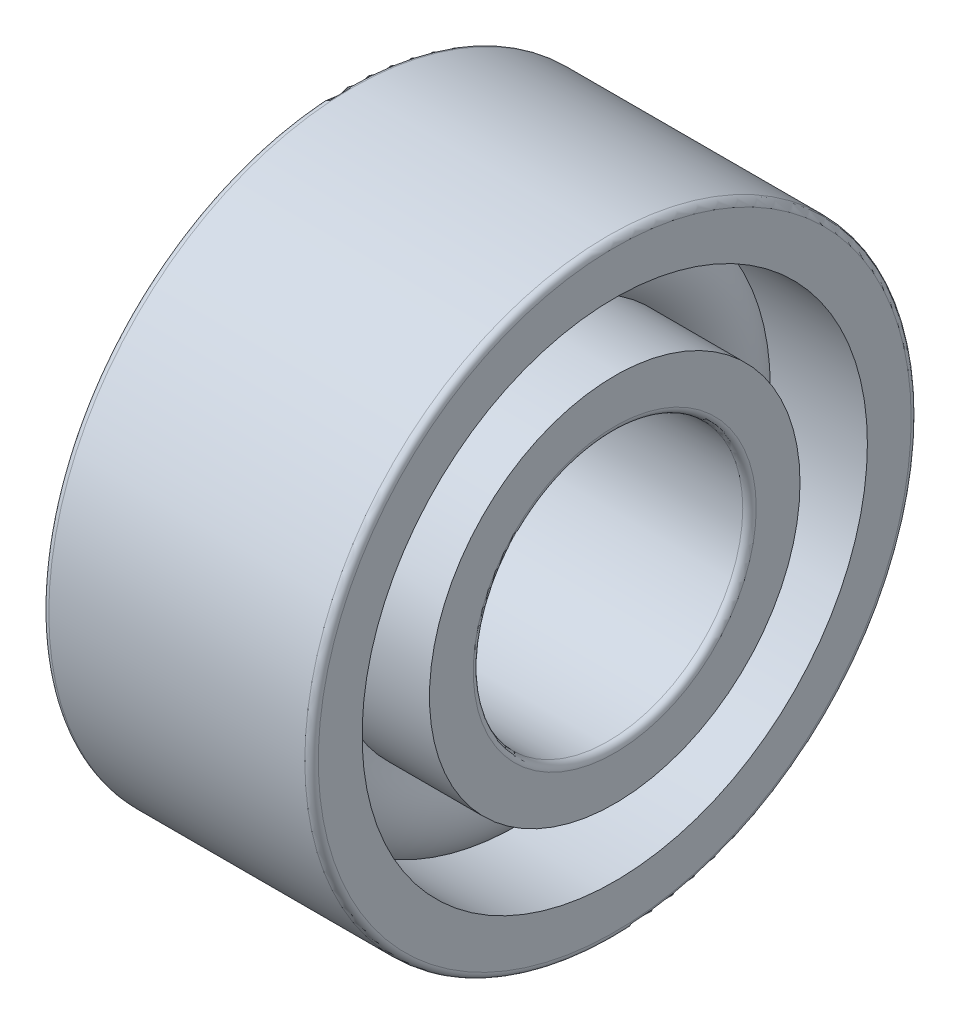
ISO-10303-21;
HEADER;
FILE_DESCRIPTION(('STEP AP214'),'2;1');
FILE_NAME('part.step','',(''),(''),'','','');
FILE_SCHEMA(('AUTOMOTIVE_DESIGN { 1 0 10303 214 1 1 1 1 }'));
ENDSEC;
DATA;
#1=APPLICATION_CONTEXT('core data for automotive mechanical design processes');
#2=APPLICATION_PROTOCOL_DEFINITION('international standard','automotive_design',2000,#1);
#3=PRODUCT_CONTEXT('',#1,'mechanical');
#4=PRODUCT('Part','Part','',(#3));
#5=PRODUCT_RELATED_PRODUCT_CATEGORY('part','',(#4));
#6=PRODUCT_DEFINITION_FORMATION('','',#4);
#7=PRODUCT_DEFINITION_CONTEXT('part definition',#1,'design');
#8=PRODUCT_DEFINITION('design','',#6,#7);
#9=PRODUCT_DEFINITION_SHAPE('','',#8);
#10=(LENGTH_UNIT() NAMED_UNIT(*) SI_UNIT(.MILLI.,.METRE.));
#11=(NAMED_UNIT(*) PLANE_ANGLE_UNIT() SI_UNIT($,.RADIAN.));
#12=(NAMED_UNIT(*) SI_UNIT($,.STERADIAN.) SOLID_ANGLE_UNIT());
#13=UNCERTAINTY_MEASURE_WITH_UNIT(LENGTH_MEASURE(1.E-05),#10,'distance_accuracy_value','');
#14=(GEOMETRIC_REPRESENTATION_CONTEXT(3) GLOBAL_UNCERTAINTY_ASSIGNED_CONTEXT((#13)) GLOBAL_UNIT_ASSIGNED_CONTEXT((#10,
#11,#12)) REPRESENTATION_CONTEXT('',''));
#15=CARTESIAN_POINT('',(0.,0.,0.));
#16=DIRECTION('',(0.,0.,1.));
#17=DIRECTION('',(1.,0.,0.));
#18=AXIS2_PLACEMENT_3D('',#15,#16,#17);
#19=CARTESIAN_POINT('',(0.,0.,0.));
#20=DIRECTION('',(-1.,0.,0.));
#21=DIRECTION('',(0.,0.,1.));
#22=AXIS2_PLACEMENT_3D('',#19,#20,#21);
#23=TOROIDAL_SURFACE('',#22,3.25,0.75);
#24=CARTESIAN_POINT('',(0.559016994374943,0.,0.));
#25=DIRECTION('',(-1.,0.,0.));
#26=DIRECTION('',(0.,0.,1.));
#27=AXIS2_PLACEMENT_3D('',#24,#25,#26);
#28=CIRCLE('',#27,3.75);
#29=CARTESIAN_POINT('',(0.559016994374943,0.,3.75));
#30=VERTEX_POINT('',#29);
#31=EDGE_CURVE('E35',#30,#30,#28,.F.);
#32=ORIENTED_EDGE('',*,*,#31,.T.);
#33=EDGE_LOOP('',(#32));
#34=FACE_BOUND('',#33,.T.);
#35=CARTESIAN_POINT('',(0.559016994374948,0.,0.));
#36=DIRECTION('',(-1.,0.,0.));
#37=DIRECTION('',(0.,0.,1.));
#38=AXIS2_PLACEMENT_3D('',#35,#36,#37);
#39=CIRCLE('',#38,2.75);
#40=CARTESIAN_POINT('',(0.559016994374948,0.,2.75));
#41=VERTEX_POINT('',#40);
#42=EDGE_CURVE('E10',#41,#41,#39,.T.);
#43=ORIENTED_EDGE('',*,*,#42,.T.);
#44=EDGE_LOOP('',(#43));
#45=FACE_BOUND('',#44,.T.);
#46=ADVANCED_FACE('F31',(#34,#45),#23,.T.);
#47=CARTESIAN_POINT('',(-20.6375,0.,0.));
#48=DIRECTION('',(1.,0.,0.));
#49=DIRECTION('',(0.,0.,-1.));
#50=AXIS2_PLACEMENT_3D('',#47,#48,#49);
#51=CYLINDRICAL_SURFACE('',#50,2.75);
#52=CARTESIAN_POINT('',(2.,0.,0.));
#53=DIRECTION('',(1.,0.,0.));
#54=DIRECTION('',(0.,0.,-1.));
#55=AXIS2_PLACEMENT_3D('',#52,#53,#54);
#56=CIRCLE('',#55,2.75);
#57=CARTESIAN_POINT('',(2.,0.,-2.75));
#58=VERTEX_POINT('',#57);
#59=EDGE_CURVE('E44',#58,#58,#56,.T.);
#60=ORIENTED_EDGE('',*,*,#59,.F.);
#61=EDGE_LOOP('',(#60));
#62=FACE_BOUND('',#61,.T.);
#63=ORIENTED_EDGE('',*,*,#42,.F.);
#64=EDGE_LOOP('',(#63));
#65=FACE_BOUND('',#64,.T.);
#66=ADVANCED_FACE('F83',(#62,#65),#51,.T.);
#67=CARTESIAN_POINT('',(-20.6375,0.,0.));
#68=DIRECTION('',(1.,0.,0.));
#69=DIRECTION('',(0.,0.,-1.));
#70=AXIS2_PLACEMENT_3D('',#67,#68,#69);
#71=CYLINDRICAL_SURFACE('',#70,2.75);
#72=CARTESIAN_POINT('',(-2.,0.,0.));
#73=DIRECTION('',(1.,0.,0.));
#74=DIRECTION('',(0.,0.,-1.));
#75=AXIS2_PLACEMENT_3D('',#72,#73,#74);
#76=CIRCLE('',#75,2.75);
#77=CARTESIAN_POINT('',(-2.,0.,-2.75));
#78=VERTEX_POINT('',#77);
#79=EDGE_CURVE('E53',#78,#78,#76,.T.);
#80=ORIENTED_EDGE('',*,*,#79,.T.);
#81=EDGE_LOOP('',(#80));
#82=FACE_BOUND('',#81,.T.);
#83=CARTESIAN_POINT('',(-0.559016994374948,0.,0.));
#84=DIRECTION('',(1.,0.,0.));
#85=DIRECTION('',(0.,0.,-1.));
#86=AXIS2_PLACEMENT_3D('',#83,#84,#85);
#87=CIRCLE('',#86,2.75);
#88=CARTESIAN_POINT('',(-0.559016994374948,0.,-2.75));
#89=VERTEX_POINT('',#88);
#90=EDGE_CURVE('E39',#89,#89,#87,.T.);
#91=ORIENTED_EDGE('',*,*,#90,.F.);
#92=EDGE_LOOP('',(#91));
#93=FACE_BOUND('',#92,.T.);
#94=ADVANCED_FACE('F86',(#82,#93),#71,.T.);
#95=CARTESIAN_POINT('',(2.,2.1,0.));
#96=DIRECTION('',(1.,0.,0.));
#97=DIRECTION('',(0.,0.,-1.));
#98=AXIS2_PLACEMENT_3D('',#95,#96,#97);
#99=PLANE('',#98);
#100=ORIENTED_EDGE('',*,*,#59,.T.);
#101=EDGE_LOOP('',(#100));
#102=FACE_BOUND('',#101,.T.);
#103=CARTESIAN_POINT('',(2.,0.,0.));
#104=DIRECTION('',(1.,0.,0.));
#105=DIRECTION('',(0.,0.,-1.));
#106=AXIS2_PLACEMENT_3D('',#103,#104,#105);
#107=CIRCLE('',#106,2.1);
#108=CARTESIAN_POINT('',(2.,0.,-2.1));
#109=VERTEX_POINT('',#108);
#110=EDGE_CURVE('E75',#109,#109,#107,.T.);
#111=ORIENTED_EDGE('',*,*,#110,.F.);
#112=EDGE_LOOP('',(#111));
#113=FACE_BOUND('',#112,.T.);
#114=ADVANCED_FACE('F80',(#102,#113),#99,.T.);
#115=CARTESIAN_POINT('',(1.9,0.,0.));
#116=DIRECTION('',(1.,0.,0.));
#117=DIRECTION('',(0.,0.,-1.));
#118=AXIS2_PLACEMENT_3D('',#115,#116,#117);
#119=TOROIDAL_SURFACE('',#118,2.1,0.0999999999999999);
#120=ORIENTED_EDGE('',*,*,#110,.T.);
#121=EDGE_LOOP('',(#120));
#122=FACE_BOUND('',#121,.T.);
#123=CARTESIAN_POINT('',(1.9,0.,0.));
#124=DIRECTION('',(1.,0.,0.));
#125=DIRECTION('',(0.,0.,-1.));
#126=AXIS2_PLACEMENT_3D('',#123,#124,#125);
#127=CIRCLE('',#126,2.);
#128=CARTESIAN_POINT('',(1.9,0.,-2.));
#129=VERTEX_POINT('',#128);
#130=EDGE_CURVE('E72',#129,#129,#127,.T.);
#131=ORIENTED_EDGE('',*,*,#130,.F.);
#132=EDGE_LOOP('',(#131));
#133=FACE_BOUND('',#132,.T.);
#134=ADVANCED_FACE('F97',(#122,#133),#119,.T.);
#135=CARTESIAN_POINT('',(-20.6375,0.,0.));
#136=DIRECTION('',(1.,0.,0.));
#137=DIRECTION('',(0.,0.,-1.));
#138=AXIS2_PLACEMENT_3D('',#135,#136,#137);
#139=CYLINDRICAL_SURFACE('',#138,2.);
#140=ORIENTED_EDGE('',*,*,#130,.T.);
#141=EDGE_LOOP('',(#140));
#142=FACE_BOUND('',#141,.T.);
#143=CARTESIAN_POINT('',(-1.9,0.,0.));
#144=DIRECTION('',(1.,0.,0.));
#145=DIRECTION('',(0.,0.,-1.));
#146=AXIS2_PLACEMENT_3D('',#143,#144,#145);
#147=CIRCLE('',#146,2.);
#148=CARTESIAN_POINT('',(-1.9,0.,-2.));
#149=VERTEX_POINT('',#148);
#150=EDGE_CURVE('E69',#149,#149,#147,.T.);
#151=ORIENTED_EDGE('',*,*,#150,.F.);
#152=EDGE_LOOP('',(#151));
#153=FACE_BOUND('',#152,.T.);
#154=ADVANCED_FACE('F100',(#142,#153),#139,.F.);
#155=CARTESIAN_POINT('',(-1.9,0.,0.));
#156=DIRECTION('',(1.,0.,0.));
#157=DIRECTION('',(0.,0.,-1.));
#158=AXIS2_PLACEMENT_3D('',#155,#156,#157);
#159=TOROIDAL_SURFACE('',#158,2.1,0.0999999999999999);
#160=ORIENTED_EDGE('',*,*,#150,.T.);
#161=EDGE_LOOP('',(#160));
#162=FACE_BOUND('',#161,.T.);
#163=CARTESIAN_POINT('',(-2.,0.,0.));
#164=DIRECTION('',(1.,0.,0.));
#165=DIRECTION('',(0.,0.,-1.));
#166=AXIS2_PLACEMENT_3D('',#163,#164,#165);
#167=CIRCLE('',#166,2.1);
#168=CARTESIAN_POINT('',(-2.,0.,-2.1));
#169=VERTEX_POINT('',#168);
#170=EDGE_CURVE('E66',#169,#169,#167,.T.);
#171=ORIENTED_EDGE('',*,*,#170,.F.);
#172=EDGE_LOOP('',(#171));
#173=FACE_BOUND('',#172,.T.);
#174=ADVANCED_FACE('F104',(#162,#173),#159,.T.);
#175=CARTESIAN_POINT('',(-2.,2.75,0.));
#176=DIRECTION('',(-1.,0.,0.));
#177=DIRECTION('',(0.,0.,1.));
#178=AXIS2_PLACEMENT_3D('',#175,#176,#177);
#179=PLANE('',#178);
#180=ORIENTED_EDGE('',*,*,#170,.T.);
#181=EDGE_LOOP('',(#180));
#182=FACE_BOUND('',#181,.T.);
#183=ORIENTED_EDGE('',*,*,#79,.F.);
#184=EDGE_LOOP('',(#183));
#185=FACE_BOUND('',#184,.T.);
#186=ADVANCED_FACE('F108',(#182,#185),#179,.T.);
#187=CARTESIAN_POINT('',(-0.559016994374943,0.,0.));
#188=DIRECTION('',(1.,0.,0.));
#189=DIRECTION('',(0.,0.,-1.));
#190=AXIS2_PLACEMENT_3D('',#187,#188,#189);
#191=CIRCLE('',#190,3.75);
#192=CARTESIAN_POINT('',(-0.559016994374943,0.,-3.75));
#193=VERTEX_POINT('',#192);
#194=EDGE_CURVE('E47',#193,#193,#191,.F.);
#195=ORIENTED_EDGE('',*,*,#194,.T.);
#196=EDGE_LOOP('',(#195));
#197=FACE_BOUND('',#196,.T.);
#198=ORIENTED_EDGE('',*,*,#90,.T.);
#199=EDGE_LOOP('',(#198));
#200=FACE_BOUND('',#199,.T.);
#201=ADVANCED_FACE('F33',(#197,#200),#23,.T.);
#202=CARTESIAN_POINT('',(-20.6375,0.,0.));
#203=DIRECTION('',(1.,0.,0.));
#204=DIRECTION('',(0.,0.,-1.));
#205=AXIS2_PLACEMENT_3D('',#202,#203,#204);
#206=CYLINDRICAL_SURFACE('',#205,3.75);
#207=CARTESIAN_POINT('',(2.,0.,0.));
#208=DIRECTION('',(1.,0.,0.));
#209=DIRECTION('',(0.,0.,-1.));
#210=AXIS2_PLACEMENT_3D('',#207,#208,#209);
#211=CIRCLE('',#210,3.75);
#212=CARTESIAN_POINT('',(2.,0.,-3.75));
#213=VERTEX_POINT('',#212);
#214=EDGE_CURVE('E49',#213,#213,#211,.T.);
#215=ORIENTED_EDGE('',*,*,#214,.T.);
#216=EDGE_LOOP('',(#215));
#217=FACE_BOUND('',#216,.T.);
#218=ORIENTED_EDGE('',*,*,#31,.F.);
#219=EDGE_LOOP('',(#218));
#220=FACE_BOUND('',#219,.T.);
#221=ADVANCED_FACE('F113',(#217,#220),#206,.F.);
#222=CARTESIAN_POINT('',(-20.6375,0.,0.));
#223=DIRECTION('',(1.,0.,0.));
#224=DIRECTION('',(0.,0.,-1.));
#225=AXIS2_PLACEMENT_3D('',#222,#223,#224);
#226=CYLINDRICAL_SURFACE('',#225,3.75);
#227=CARTESIAN_POINT('',(-2.,0.,0.));
#228=DIRECTION('',(1.,0.,0.));
#229=DIRECTION('',(0.,0.,-1.));
#230=AXIS2_PLACEMENT_3D('',#227,#228,#229);
#231=CIRCLE('',#230,3.75);
#232=CARTESIAN_POINT('',(-2.,0.,-3.75));
#233=VERTEX_POINT('',#232);
#234=EDGE_CURVE('E144',#233,#233,#231,.T.);
#235=ORIENTED_EDGE('',*,*,#234,.F.);
#236=EDGE_LOOP('',(#235));
#237=FACE_BOUND('',#236,.T.);
#238=ORIENTED_EDGE('',*,*,#194,.F.);
#239=EDGE_LOOP('',(#238));
#240=FACE_BOUND('',#239,.T.);
#241=ADVANCED_FACE('F116',(#237,#240),#226,.F.);
#242=CARTESIAN_POINT('',(2.,4.4,0.));
#243=DIRECTION('',(1.,0.,0.));
#244=DIRECTION('',(0.,0.,-1.));
#245=AXIS2_PLACEMENT_3D('',#242,#243,#244);
#246=PLANE('',#245);
#247=CARTESIAN_POINT('',(2.,0.,0.));
#248=DIRECTION('',(1.,0.,0.));
#249=DIRECTION('',(0.,0.,-1.));
#250=AXIS2_PLACEMENT_3D('',#247,#248,#249);
#251=CIRCLE('',#250,4.4);
#252=CARTESIAN_POINT('',(2.,0.,-4.4));
#253=VERTEX_POINT('',#252);
#254=EDGE_CURVE('E55',#253,#253,#251,.T.);
#255=ORIENTED_EDGE('',*,*,#254,.T.);
#256=EDGE_LOOP('',(#255));
#257=FACE_BOUND('',#256,.T.);
#258=ORIENTED_EDGE('',*,*,#214,.F.);
#259=EDGE_LOOP('',(#258));
#260=FACE_BOUND('',#259,.T.);
#261=ADVANCED_FACE('F117',(#257,#260),#246,.T.);
#262=CARTESIAN_POINT('',(1.9,0.,0.));
#263=DIRECTION('',(1.,0.,0.));
#264=DIRECTION('',(0.,0.,-1.));
#265=AXIS2_PLACEMENT_3D('',#262,#263,#264);
#266=TOROIDAL_SURFACE('',#265,4.4,0.100000000000001);
#267=CARTESIAN_POINT('',(1.9,0.,0.));
#268=DIRECTION('',(1.,0.,0.));
#269=DIRECTION('',(0.,0.,-1.));
#270=AXIS2_PLACEMENT_3D('',#267,#268,#269);
#271=CIRCLE('',#270,4.50000000000001);
#272=CARTESIAN_POINT('',(1.9,0.,-4.50000000000001));
#273=VERTEX_POINT('',#272);
#274=EDGE_CURVE('E60',#273,#273,#271,.T.);
#275=ORIENTED_EDGE('',*,*,#274,.T.);
#276=EDGE_LOOP('',(#275));
#277=FACE_BOUND('',#276,.T.);
#278=ORIENTED_EDGE('',*,*,#254,.F.);
#279=EDGE_LOOP('',(#278));
#280=FACE_BOUND('',#279,.T.);
#281=ADVANCED_FACE('F120',(#277,#280),#266,.T.);
#282=CARTESIAN_POINT('',(-20.6375,0.,0.));
#283=DIRECTION('',(1.,0.,0.));
#284=DIRECTION('',(0.,0.,-1.));
#285=AXIS2_PLACEMENT_3D('',#282,#283,#284);
#286=CYLINDRICAL_SURFACE('',#285,4.50000000000001);
#287=CARTESIAN_POINT('',(-1.9,0.,0.));
#288=DIRECTION('',(1.,0.,0.));
#289=DIRECTION('',(0.,0.,-1.));
#290=AXIS2_PLACEMENT_3D('',#287,#288,#289);
#291=CIRCLE('',#290,4.5);
#292=CARTESIAN_POINT('',(-1.9,0.,-4.5));
#293=VERTEX_POINT('',#292);
#294=EDGE_CURVE('E148',#293,#293,#291,.T.);
#295=ORIENTED_EDGE('',*,*,#294,.T.);
#296=EDGE_LOOP('',(#295));
#297=FACE_BOUND('',#296,.T.);
#298=ORIENTED_EDGE('',*,*,#274,.F.);
#299=EDGE_LOOP('',(#298));
#300=FACE_BOUND('',#299,.T.);
#301=ADVANCED_FACE('F124',(#297,#300),#286,.T.);
#302=CARTESIAN_POINT('',(-1.9,0.,0.));
#303=DIRECTION('',(1.,0.,0.));
#304=DIRECTION('',(0.,0.,-1.));
#305=AXIS2_PLACEMENT_3D('',#302,#303,#304);
#306=TOROIDAL_SURFACE('',#305,4.4,0.100000000000001);
#307=CARTESIAN_POINT('',(-2.,0.,0.));
#308=DIRECTION('',(1.,0.,0.));
#309=DIRECTION('',(0.,0.,-1.));
#310=AXIS2_PLACEMENT_3D('',#307,#308,#309);
#311=CIRCLE('',#310,4.4);
#312=CARTESIAN_POINT('',(-2.,0.,-4.4));
#313=VERTEX_POINT('',#312);
#314=EDGE_CURVE('E145',#313,#313,#311,.T.);
#315=ORIENTED_EDGE('',*,*,#314,.T.);
#316=EDGE_LOOP('',(#315));
#317=FACE_BOUND('',#316,.T.);
#318=ORIENTED_EDGE('',*,*,#294,.F.);
#319=EDGE_LOOP('',(#318));
#320=FACE_BOUND('',#319,.T.);
#321=ADVANCED_FACE('F128',(#317,#320),#306,.T.);
#322=CARTESIAN_POINT('',(-2.,3.75,0.));
#323=DIRECTION('',(-1.,0.,0.));
#324=DIRECTION('',(0.,0.,1.));
#325=AXIS2_PLACEMENT_3D('',#322,#323,#324);
#326=PLANE('',#325);
#327=ORIENTED_EDGE('',*,*,#234,.T.);
#328=EDGE_LOOP('',(#327));
#329=FACE_BOUND('',#328,.T.);
#330=ORIENTED_EDGE('',*,*,#314,.F.);
#331=EDGE_LOOP('',(#330));
#332=FACE_BOUND('',#331,.T.);
#333=ADVANCED_FACE('F132',(#329,#332),#326,.T.);
#334=CLOSED_SHELL('',(#46,#66,#94,#114,#134,#154,#174,#186,#201,#221,#241,#261,#281,#301,#321,#333));
#335=MANIFOLD_SOLID_BREP('B2',#334);
#336=ADVANCED_BREP_SHAPE_REPRESENTATION('',(#18,#335),#14);
#337=SHAPE_DEFINITION_REPRESENTATION(#9,#336);
ENDSEC;
END-ISO-10303-21;
